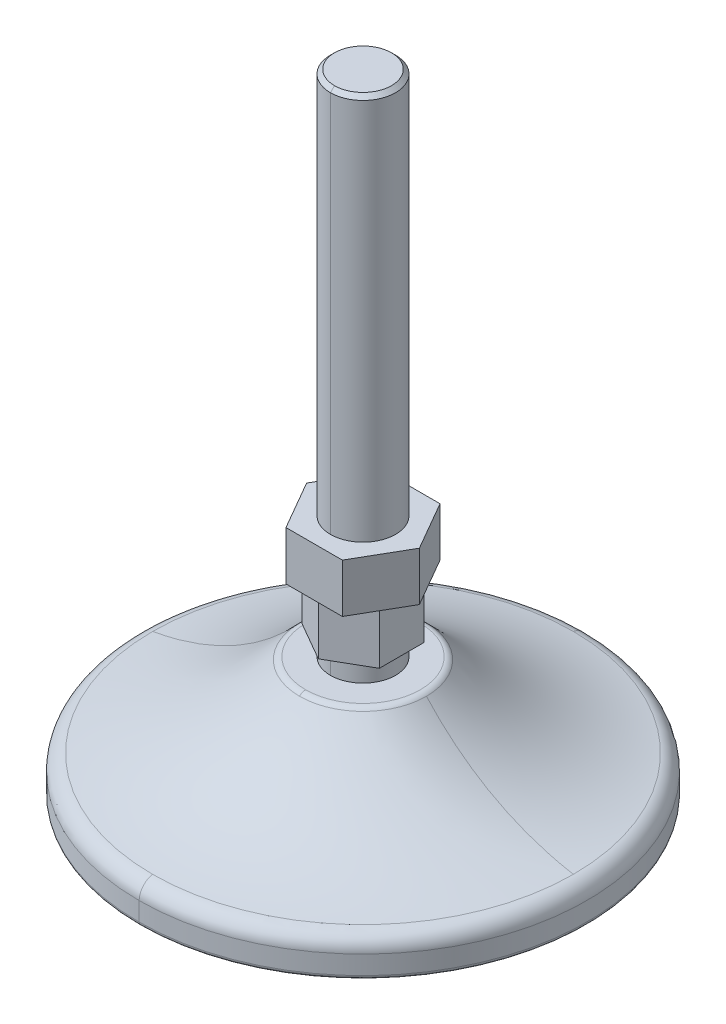
ISO-10303-21;
HEADER;
FILE_DESCRIPTION(('STEP AP214'),'2;1');
FILE_NAME('part.step','',(''),(''),'','','');
FILE_SCHEMA(('AUTOMOTIVE_DESIGN { 1 0 10303 214 1 1 1 1 }'));
ENDSEC;
DATA;
#1=APPLICATION_CONTEXT('core data for automotive mechanical design processes');
#2=APPLICATION_PROTOCOL_DEFINITION('international standard','automotive_design',2000,#1);
#3=PRODUCT_CONTEXT('',#1,'mechanical');
#4=PRODUCT('Part','Part','',(#3));
#5=PRODUCT_RELATED_PRODUCT_CATEGORY('part','',(#4));
#6=PRODUCT_DEFINITION_FORMATION('','',#4);
#7=PRODUCT_DEFINITION_CONTEXT('part definition',#1,'design');
#8=PRODUCT_DEFINITION('design','',#6,#7);
#9=PRODUCT_DEFINITION_SHAPE('','',#8);
#10=(LENGTH_UNIT() NAMED_UNIT(*) SI_UNIT(.MILLI.,.METRE.));
#11=(NAMED_UNIT(*) PLANE_ANGLE_UNIT() SI_UNIT($,.RADIAN.));
#12=(NAMED_UNIT(*) SI_UNIT($,.STERADIAN.) SOLID_ANGLE_UNIT());
#13=UNCERTAINTY_MEASURE_WITH_UNIT(LENGTH_MEASURE(1.E-05),#10,'distance_accuracy_value','');
#14=(GEOMETRIC_REPRESENTATION_CONTEXT(3) GLOBAL_UNCERTAINTY_ASSIGNED_CONTEXT((#13)) GLOBAL_UNIT_ASSIGNED_CONTEXT((#10,
#11,#12)) REPRESENTATION_CONTEXT('',''));
#15=CARTESIAN_POINT('',(0.,0.,0.));
#16=DIRECTION('',(0.,0.,1.));
#17=DIRECTION('',(1.,0.,0.));
#18=AXIS2_PLACEMENT_3D('',#15,#16,#17);
#19=CARTESIAN_POINT('',(0.,0.,0.));
#20=DIRECTION('',(0.,1.,0.));
#21=DIRECTION('',(0.,0.,1.));
#22=AXIS2_PLACEMENT_3D('',#19,#20,#21);
#23=CYLINDRICAL_SURFACE('',#22,8.);
#24=DIRECTION('',(0.,1.,0.));
#25=VECTOR('',#24,1.);
#26=CARTESIAN_POINT('',(0.,0.,-8.));
#27=LINE('',#26,#25);
#28=CARTESIAN_POINT('',(0.,-95.,-8.));
#29=VERTEX_POINT('',#28);
#30=CARTESIAN_POINT('',(0.,-1.,-8.));
#31=VERTEX_POINT('',#30);
#32=EDGE_CURVE('E297',#29,#31,#27,.T.);
#33=ORIENTED_EDGE('',*,*,#32,.F.);
#34=CARTESIAN_POINT('',(0.,-95.,0.));
#35=DIRECTION('',(0.,-1.,0.));
#36=DIRECTION('',(0.,0.,1.));
#37=AXIS2_PLACEMENT_3D('',#34,#35,#36);
#38=CIRCLE('',#37,8.);
#39=CARTESIAN_POINT('',(0.,-95.,8.));
#40=VERTEX_POINT('',#39);
#41=EDGE_CURVE('E408',#40,#29,#38,.T.);
#42=ORIENTED_EDGE('',*,*,#41,.F.);
#43=DIRECTION('',(0.,1.,0.));
#44=VECTOR('',#43,1.);
#45=CARTESIAN_POINT('',(0.,0.,8.));
#46=LINE('',#45,#44);
#47=CARTESIAN_POINT('',(0.,-1.,8.));
#48=VERTEX_POINT('',#47);
#49=EDGE_CURVE('E296',#40,#48,#46,.T.);
#50=ORIENTED_EDGE('',*,*,#49,.T.);
#51=CARTESIAN_POINT('',(0.,-1.,0.));
#52=DIRECTION('',(0.,1.,0.));
#53=DIRECTION('',(0.,0.,1.));
#54=AXIS2_PLACEMENT_3D('',#51,#52,#53);
#55=CIRCLE('',#54,8.);
#56=EDGE_CURVE('E10',#31,#48,#55,.T.);
#57=ORIENTED_EDGE('',*,*,#56,.F.);
#58=EDGE_LOOP('',(#33,#42,#50,#57));
#59=FACE_BOUND('',#58,.T.);
#60=ADVANCED_FACE('F16',(#59),#23,.T.);
#61=CARTESIAN_POINT('',(0.,0.,0.));
#62=DIRECTION('',(0.,-1.,0.));
#63=DIRECTION('',(0.,0.,-1.));
#64=AXIS2_PLACEMENT_3D('',#61,#62,#63);
#65=CONICAL_SURFACE('',#64,7.,0.785398163397448);
#66=DIRECTION('',(0.,-0.707106781186548,0.707106781186548));
#67=VECTOR('',#66,1.);
#68=CARTESIAN_POINT('',(0.,0.,7.));
#69=LINE('',#68,#67);
#70=CARTESIAN_POINT('',(0.,0.,7.));
#71=VERTEX_POINT('',#70);
#72=EDGE_CURVE('E402',#71,#48,#69,.T.);
#73=ORIENTED_EDGE('',*,*,#72,.F.);
#74=CARTESIAN_POINT('',(0.,0.,0.));
#75=DIRECTION('',(0.,1.,0.));
#76=DIRECTION('',(0.,0.,1.));
#77=AXIS2_PLACEMENT_3D('',#74,#75,#76);
#78=CIRCLE('',#77,7.);
#79=CARTESIAN_POINT('',(0.,0.,-7.));
#80=VERTEX_POINT('',#79);
#81=EDGE_CURVE('E27',#80,#71,#78,.T.);
#82=ORIENTED_EDGE('',*,*,#81,.F.);
#83=DIRECTION('',(0.,-0.707106781186548,-0.707106781186548));
#84=VECTOR('',#83,1.);
#85=CARTESIAN_POINT('',(0.,0.,-7.));
#86=LINE('',#85,#84);
#87=EDGE_CURVE('E362',#80,#31,#86,.T.);
#88=ORIENTED_EDGE('',*,*,#87,.T.);
#89=ORIENTED_EDGE('',*,*,#56,.T.);
#90=EDGE_LOOP('',(#73,#82,#88,#89));
#91=FACE_BOUND('',#90,.T.);
#92=ADVANCED_FACE('F533',(#91),#65,.T.);
#93=CARTESIAN_POINT('',(0.,0.,0.));
#94=DIRECTION('',(0.,1.,0.));
#95=DIRECTION('',(1.,0.,0.));
#96=AXIS2_PLACEMENT_3D('',#93,#94,#95);
#97=PLANE('',#96);
#98=ORIENTED_EDGE('',*,*,#81,.T.);
#99=CARTESIAN_POINT('',(0.,0.,0.));
#100=DIRECTION('',(0.,1.,0.));
#101=DIRECTION('',(0.,0.,1.));
#102=AXIS2_PLACEMENT_3D('',#99,#100,#101);
#103=CIRCLE('',#102,7.);
#104=EDGE_CURVE('E389',#71,#80,#103,.T.);
#105=ORIENTED_EDGE('',*,*,#104,.T.);
#106=EDGE_LOOP('',(#98,#105));
#107=FACE_BOUND('',#106,.T.);
#108=ADVANCED_FACE('F549',(#107),#97,.T.);
#109=CARTESIAN_POINT('',(0.,-95.,0.));
#110=DIRECTION('',(0.,1.,0.));
#111=DIRECTION('',(1.,0.,0.));
#112=AXIS2_PLACEMENT_3D('',#109,#110,#111);
#113=PLANE('',#112);
#114=ORIENTED_EDGE('',*,*,#41,.T.);
#115=CARTESIAN_POINT('',(0.,-95.,0.));
#116=DIRECTION('',(0.,-1.,0.));
#117=DIRECTION('',(0.,0.,1.));
#118=AXIS2_PLACEMENT_3D('',#115,#116,#117);
#119=CIRCLE('',#118,8.);
#120=EDGE_CURVE('E444',#29,#40,#119,.T.);
#121=ORIENTED_EDGE('',*,*,#120,.T.);
#122=EDGE_LOOP('',(#114,#121));
#123=FACE_BOUND('',#122,.T.);
#124=DIRECTION('',(0.5,0.,-0.866025403784439));
#125=VECTOR('',#124,1.);
#126=CARTESIAN_POINT('',(6.92820323027551,-95.,12.));
#127=LINE('',#126,#125);
#128=CARTESIAN_POINT('',(6.92820323027551,-95.,12.));
#129=VERTEX_POINT('',#128);
#130=CARTESIAN_POINT('',(13.856406460551,-95.,0.));
#131=VERTEX_POINT('',#130);
#132=EDGE_CURVE('E368',#129,#131,#127,.T.);
#133=ORIENTED_EDGE('',*,*,#132,.T.);
#134=DIRECTION('',(-0.5,0.,-0.866025403784438));
#135=VECTOR('',#134,1.);
#136=CARTESIAN_POINT('',(13.856406460551,-95.,0.));
#137=LINE('',#136,#135);
#138=CARTESIAN_POINT('',(6.92820323027551,-95.,-12.));
#139=VERTEX_POINT('',#138);
#140=EDGE_CURVE('E415',#131,#139,#137,.T.);
#141=ORIENTED_EDGE('',*,*,#140,.T.);
#142=DIRECTION('',(-1.,0.,0.));
#143=VECTOR('',#142,1.);
#144=CARTESIAN_POINT('',(6.92820323027551,-95.,-12.));
#145=LINE('',#144,#143);
#146=CARTESIAN_POINT('',(-6.92820323027551,-95.,-12.));
#147=VERTEX_POINT('',#146);
#148=EDGE_CURVE('E414',#139,#147,#145,.T.);
#149=ORIENTED_EDGE('',*,*,#148,.T.);
#150=DIRECTION('',(-0.5,0.,0.866025403784439));
#151=VECTOR('',#150,1.);
#152=CARTESIAN_POINT('',(-6.92820323027551,-95.,-12.));
#153=LINE('',#152,#151);
#154=CARTESIAN_POINT('',(-13.856406460551,-95.,0.));
#155=VERTEX_POINT('',#154);
#156=EDGE_CURVE('E247',#147,#155,#153,.T.);
#157=ORIENTED_EDGE('',*,*,#156,.T.);
#158=DIRECTION('',(0.5,0.,0.866025403784439));
#159=VECTOR('',#158,1.);
#160=CARTESIAN_POINT('',(-13.856406460551,-95.,0.));
#161=LINE('',#160,#159);
#162=CARTESIAN_POINT('',(-6.9282032302755,-95.,12.));
#163=VERTEX_POINT('',#162);
#164=EDGE_CURVE('E246',#155,#163,#161,.T.);
#165=ORIENTED_EDGE('',*,*,#164,.T.);
#166=DIRECTION('',(1.,0.,0.));
#167=VECTOR('',#166,1.);
#168=CARTESIAN_POINT('',(-6.9282032302755,-95.,12.));
#169=LINE('',#168,#167);
#170=EDGE_CURVE('E42',#163,#129,#169,.T.);
#171=ORIENTED_EDGE('',*,*,#170,.T.);
#172=EDGE_LOOP('',(#133,#141,#149,#157,#165,#171));
#173=FACE_BOUND('',#172,.T.);
#174=ADVANCED_FACE('F546',(#123,#173),#113,.T.);
#175=CARTESIAN_POINT('',(-6.9282032302755,-95.,12.));
#176=DIRECTION('',(0.,0.,-1.));
#177=DIRECTION('',(0.,-1.,0.));
#178=AXIS2_PLACEMENT_3D('',#175,#176,#177);
#179=PLANE('',#178);
#180=DIRECTION('',(1.,0.,0.));
#181=VECTOR('',#180,1.);
#182=CARTESIAN_POINT('',(-6.9282032302755,-107.,12.));
#183=LINE('',#182,#181);
#184=CARTESIAN_POINT('',(-6.9282032302755,-107.,12.));
#185=VERTEX_POINT('',#184);
#186=CARTESIAN_POINT('',(6.92820323027551,-107.,12.));
#187=VERTEX_POINT('',#186);
#188=EDGE_CURVE('E242',#185,#187,#183,.T.);
#189=ORIENTED_EDGE('',*,*,#188,.T.);
#190=DIRECTION('',(0.,-1.,0.));
#191=VECTOR('',#190,1.);
#192=CARTESIAN_POINT('',(6.92820323027551,-95.,12.));
#193=LINE('',#192,#191);
#194=EDGE_CURVE('E225',#129,#187,#193,.T.);
#195=ORIENTED_EDGE('',*,*,#194,.F.);
#196=ORIENTED_EDGE('',*,*,#170,.F.);
#197=DIRECTION('',(0.,-1.,0.));
#198=VECTOR('',#197,1.);
#199=CARTESIAN_POINT('',(-6.9282032302755,-95.,12.));
#200=LINE('',#199,#198);
#201=EDGE_CURVE('E238',#163,#185,#200,.T.);
#202=ORIENTED_EDGE('',*,*,#201,.T.);
#203=EDGE_LOOP('',(#189,#195,#196,#202));
#204=FACE_BOUND('',#203,.T.);
#205=ADVANCED_FACE('F240',(#204),#179,.F.);
#206=CARTESIAN_POINT('',(-13.856406460551,-95.,0.));
#207=DIRECTION('',(0.866025403784439,0.,-0.5));
#208=DIRECTION('',(0.,-1.,0.));
#209=AXIS2_PLACEMENT_3D('',#206,#207,#208);
#210=PLANE('',#209);
#211=DIRECTION('',(0.5,0.,0.866025403784439));
#212=VECTOR('',#211,1.);
#213=CARTESIAN_POINT('',(-13.856406460551,-107.,0.));
#214=LINE('',#213,#212);
#215=CARTESIAN_POINT('',(-13.856406460551,-107.,0.));
#216=VERTEX_POINT('',#215);
#217=EDGE_CURVE('E250',#216,#185,#214,.T.);
#218=ORIENTED_EDGE('',*,*,#217,.T.);
#219=ORIENTED_EDGE('',*,*,#201,.F.);
#220=ORIENTED_EDGE('',*,*,#164,.F.);
#221=DIRECTION('',(0.,-1.,0.));
#222=VECTOR('',#221,1.);
#223=CARTESIAN_POINT('',(-13.856406460551,-95.,0.));
#224=LINE('',#223,#222);
#225=EDGE_CURVE('E253',#155,#216,#224,.T.);
#226=ORIENTED_EDGE('',*,*,#225,.T.);
#227=EDGE_LOOP('',(#218,#219,#220,#226));
#228=FACE_BOUND('',#227,.T.);
#229=ADVANCED_FACE('F251',(#228),#210,.F.);
#230=CARTESIAN_POINT('',(-6.92820323027551,-95.,-12.));
#231=DIRECTION('',(0.866025403784439,0.,0.5));
#232=DIRECTION('',(0.,-1.,0.));
#233=AXIS2_PLACEMENT_3D('',#230,#231,#232);
#234=PLANE('',#233);
#235=DIRECTION('',(-0.5,0.,0.866025403784439));
#236=VECTOR('',#235,1.);
#237=CARTESIAN_POINT('',(-6.92820323027551,-107.,-12.));
#238=LINE('',#237,#236);
#239=CARTESIAN_POINT('',(-6.92820323027551,-107.,-12.));
#240=VERTEX_POINT('',#239);
#241=EDGE_CURVE('E257',#240,#216,#238,.T.);
#242=ORIENTED_EDGE('',*,*,#241,.T.);
#243=ORIENTED_EDGE('',*,*,#225,.F.);
#244=ORIENTED_EDGE('',*,*,#156,.F.);
#245=DIRECTION('',(0.,-1.,0.));
#246=VECTOR('',#245,1.);
#247=CARTESIAN_POINT('',(-6.92820323027551,-95.,-12.));
#248=LINE('',#247,#246);
#249=EDGE_CURVE('E116',#147,#240,#248,.T.);
#250=ORIENTED_EDGE('',*,*,#249,.T.);
#251=EDGE_LOOP('',(#242,#243,#244,#250));
#252=FACE_BOUND('',#251,.T.);
#253=ADVANCED_FACE('F594',(#252),#234,.F.);
#254=CARTESIAN_POINT('',(6.92820323027551,-95.,-12.));
#255=DIRECTION('',(0.,0.,1.));
#256=DIRECTION('',(1.,0.,0.));
#257=AXIS2_PLACEMENT_3D('',#254,#255,#256);
#258=PLANE('',#257);
#259=DIRECTION('',(-1.,0.,0.));
#260=VECTOR('',#259,1.);
#261=CARTESIAN_POINT('',(6.92820323027551,-107.,-12.));
#262=LINE('',#261,#260);
#263=CARTESIAN_POINT('',(6.92820323027551,-107.,-12.));
#264=VERTEX_POINT('',#263);
#265=EDGE_CURVE('E335',#264,#240,#262,.T.);
#266=ORIENTED_EDGE('',*,*,#265,.T.);
#267=ORIENTED_EDGE('',*,*,#249,.F.);
#268=ORIENTED_EDGE('',*,*,#148,.F.);
#269=DIRECTION('',(0.,-1.,0.));
#270=VECTOR('',#269,1.);
#271=CARTESIAN_POINT('',(6.92820323027551,-95.,-12.));
#272=LINE('',#271,#270);
#273=EDGE_CURVE('E103',#139,#264,#272,.T.);
#274=ORIENTED_EDGE('',*,*,#273,.T.);
#275=EDGE_LOOP('',(#266,#267,#268,#274));
#276=FACE_BOUND('',#275,.T.);
#277=ADVANCED_FACE('F562',(#276),#258,.F.);
#278=CARTESIAN_POINT('',(13.856406460551,-95.,0.));
#279=DIRECTION('',(-0.866025403784439,0.,0.5));
#280=DIRECTION('',(0.,1.,0.));
#281=AXIS2_PLACEMENT_3D('',#278,#279,#280);
#282=PLANE('',#281);
#283=DIRECTION('',(-0.5,0.,-0.866025403784438));
#284=VECTOR('',#283,1.);
#285=CARTESIAN_POINT('',(13.856406460551,-107.,0.));
#286=LINE('',#285,#284);
#287=CARTESIAN_POINT('',(13.856406460551,-107.,0.));
#288=VERTEX_POINT('',#287);
#289=EDGE_CURVE('E369',#288,#264,#286,.T.);
#290=ORIENTED_EDGE('',*,*,#289,.T.);
#291=ORIENTED_EDGE('',*,*,#273,.F.);
#292=ORIENTED_EDGE('',*,*,#140,.F.);
#293=DIRECTION('',(0.,-1.,0.));
#294=VECTOR('',#293,1.);
#295=CARTESIAN_POINT('',(13.856406460551,-95.,0.));
#296=LINE('',#295,#294);
#297=EDGE_CURVE('E232',#131,#288,#296,.T.);
#298=ORIENTED_EDGE('',*,*,#297,.T.);
#299=EDGE_LOOP('',(#290,#291,#292,#298));
#300=FACE_BOUND('',#299,.T.);
#301=ADVANCED_FACE('F552',(#300),#282,.F.);
#302=CARTESIAN_POINT('',(6.92820323027551,-95.,12.));
#303=DIRECTION('',(-0.866025403784439,0.,-0.5));
#304=DIRECTION('',(-0.5,0.,0.866025403784439));
#305=AXIS2_PLACEMENT_3D('',#302,#303,#304);
#306=PLANE('',#305);
#307=DIRECTION('',(0.5,0.,-0.866025403784439));
#308=VECTOR('',#307,1.);
#309=CARTESIAN_POINT('',(6.92820323027551,-107.,12.));
#310=LINE('',#309,#308);
#311=EDGE_CURVE('E259',#187,#288,#310,.T.);
#312=ORIENTED_EDGE('',*,*,#311,.T.);
#313=ORIENTED_EDGE('',*,*,#297,.F.);
#314=ORIENTED_EDGE('',*,*,#132,.F.);
#315=ORIENTED_EDGE('',*,*,#194,.T.);
#316=EDGE_LOOP('',(#312,#313,#314,#315));
#317=FACE_BOUND('',#316,.T.);
#318=ADVANCED_FACE('F18',(#317),#306,.F.);
#319=CARTESIAN_POINT('',(0.,-107.,0.));
#320=DIRECTION('',(0.,1.,0.));
#321=DIRECTION('',(1.,0.,0.));
#322=AXIS2_PLACEMENT_3D('',#319,#320,#321);
#323=PLANE('',#322);
#324=DIRECTION('',(0.,0.,-1.));
#325=VECTOR('',#324,1.);
#326=CARTESIAN_POINT('',(9.5,-107.,5.48482755730145));
#327=LINE('',#326,#325);
#328=CARTESIAN_POINT('',(9.5,-107.,5.48482755730145));
#329=VERTEX_POINT('',#328);
#330=CARTESIAN_POINT('',(9.5,-107.,-5.48482755730145));
#331=VERTEX_POINT('',#330);
#332=EDGE_CURVE('E266',#329,#331,#327,.T.);
#333=ORIENTED_EDGE('',*,*,#332,.T.);
#334=DIRECTION('',(-0.866025403784439,0.,-0.5));
#335=VECTOR('',#334,1.);
#336=CARTESIAN_POINT('',(9.5,-107.,-5.48482755730145));
#337=LINE('',#336,#335);
#338=CARTESIAN_POINT('',(0.,-107.,-10.9696551146029));
#339=VERTEX_POINT('',#338);
#340=EDGE_CURVE('E286',#331,#339,#337,.T.);
#341=ORIENTED_EDGE('',*,*,#340,.T.);
#342=DIRECTION('',(-0.866025403784439,0.,0.5));
#343=VECTOR('',#342,1.);
#344=CARTESIAN_POINT('',(0.,-107.,-10.9696551146029));
#345=LINE('',#344,#343);
#346=CARTESIAN_POINT('',(-9.5,-107.,-5.48482755730145));
#347=VERTEX_POINT('',#346);
#348=EDGE_CURVE('E281',#339,#347,#345,.T.);
#349=ORIENTED_EDGE('',*,*,#348,.T.);
#350=DIRECTION('',(0.,0.,1.));
#351=VECTOR('',#350,1.);
#352=CARTESIAN_POINT('',(-9.5,-107.,-5.48482755730145));
#353=LINE('',#352,#351);
#354=CARTESIAN_POINT('',(-9.5,-107.,5.48482755730144));
#355=VERTEX_POINT('',#354);
#356=EDGE_CURVE('E303',#347,#355,#353,.T.);
#357=ORIENTED_EDGE('',*,*,#356,.T.);
#358=DIRECTION('',(0.866025403784439,0.,0.5));
#359=VECTOR('',#358,1.);
#360=CARTESIAN_POINT('',(-9.5,-107.,5.48482755730144));
#361=LINE('',#360,#359);
#362=CARTESIAN_POINT('',(0.,-107.,10.9696551146029));
#363=VERTEX_POINT('',#362);
#364=EDGE_CURVE('E318',#355,#363,#361,.T.);
#365=ORIENTED_EDGE('',*,*,#364,.T.);
#366=DIRECTION('',(0.866025403784439,0.,-0.5));
#367=VECTOR('',#366,1.);
#368=CARTESIAN_POINT('',(0.,-107.,10.9696551146029));
#369=LINE('',#368,#367);
#370=EDGE_CURVE('E275',#363,#329,#369,.T.);
#371=ORIENTED_EDGE('',*,*,#370,.T.);
#372=EDGE_LOOP('',(#333,#341,#349,#357,#365,#371));
#373=FACE_BOUND('',#372,.T.);
#374=ORIENTED_EDGE('',*,*,#311,.F.);
#375=ORIENTED_EDGE('',*,*,#188,.F.);
#376=ORIENTED_EDGE('',*,*,#217,.F.);
#377=ORIENTED_EDGE('',*,*,#241,.F.);
#378=ORIENTED_EDGE('',*,*,#265,.F.);
#379=ORIENTED_EDGE('',*,*,#289,.F.);
#380=EDGE_LOOP('',(#374,#375,#376,#377,#378,#379));
#381=FACE_BOUND('',#380,.T.);
#382=ADVANCED_FACE('F258',(#373,#381),#323,.F.);
#383=CARTESIAN_POINT('',(0.,-120.,0.));
#384=DIRECTION('',(0.,1.,0.));
#385=DIRECTION('',(1.,0.,0.));
#386=AXIS2_PLACEMENT_3D('',#383,#384,#385);
#387=PLANE('',#386);
#388=CARTESIAN_POINT('',(0.,-120.,0.));
#389=DIRECTION('',(0.,-1.,0.));
#390=DIRECTION('',(0.,0.,1.));
#391=AXIS2_PLACEMENT_3D('',#388,#389,#390);
#392=CIRCLE('',#391,8.);
#393=CARTESIAN_POINT('',(0.,-120.,8.));
#394=VERTEX_POINT('',#393);
#395=CARTESIAN_POINT('',(0.,-120.,-8.));
#396=VERTEX_POINT('',#395);
#397=EDGE_CURVE('E304',#394,#396,#392,.T.);
#398=ORIENTED_EDGE('',*,*,#397,.F.);
#399=CARTESIAN_POINT('',(0.,-120.,0.));
#400=DIRECTION('',(0.,-1.,0.));
#401=DIRECTION('',(0.,0.,1.));
#402=AXIS2_PLACEMENT_3D('',#399,#400,#401);
#403=CIRCLE('',#402,8.);
#404=EDGE_CURVE('E398',#396,#394,#403,.T.);
#405=ORIENTED_EDGE('',*,*,#404,.F.);
#406=EDGE_LOOP('',(#398,#405));
#407=FACE_BOUND('',#406,.T.);
#408=DIRECTION('',(-0.866025403784439,0.,-0.5));
#409=VECTOR('',#408,1.);
#410=CARTESIAN_POINT('',(9.5,-120.,-5.48482755730145));
#411=LINE('',#410,#409);
#412=CARTESIAN_POINT('',(9.5,-120.,-5.48482755730145));
#413=VERTEX_POINT('',#412);
#414=CARTESIAN_POINT('',(0.,-120.,-10.9696551146029));
#415=VERTEX_POINT('',#414);
#416=EDGE_CURVE('E287',#413,#415,#411,.T.);
#417=ORIENTED_EDGE('',*,*,#416,.F.);
#418=DIRECTION('',(0.,0.,-1.));
#419=VECTOR('',#418,1.);
#420=CARTESIAN_POINT('',(9.5,-120.,5.48482755730145));
#421=LINE('',#420,#419);
#422=CARTESIAN_POINT('',(9.5,-120.,5.48482755730145));
#423=VERTEX_POINT('',#422);
#424=EDGE_CURVE('E272',#423,#413,#421,.T.);
#425=ORIENTED_EDGE('',*,*,#424,.F.);
#426=DIRECTION('',(0.866025403784439,0.,-0.5));
#427=VECTOR('',#426,1.);
#428=CARTESIAN_POINT('',(0.,-120.,10.9696551146029));
#429=LINE('',#428,#427);
#430=CARTESIAN_POINT('',(0.,-120.,10.9696551146029));
#431=VERTEX_POINT('',#430);
#432=EDGE_CURVE('E322',#431,#423,#429,.T.);
#433=ORIENTED_EDGE('',*,*,#432,.F.);
#434=DIRECTION('',(0.866025403784439,0.,0.5));
#435=VECTOR('',#434,1.);
#436=CARTESIAN_POINT('',(-9.5,-120.,5.48482755730144));
#437=LINE('',#436,#435);
#438=CARTESIAN_POINT('',(-9.5,-120.,5.48482755730144));
#439=VERTEX_POINT('',#438);
#440=EDGE_CURVE('E298',#439,#431,#437,.T.);
#441=ORIENTED_EDGE('',*,*,#440,.F.);
#442=DIRECTION('',(0.,0.,1.));
#443=VECTOR('',#442,1.);
#444=CARTESIAN_POINT('',(-9.5,-120.,-5.48482755730145));
#445=LINE('',#444,#443);
#446=CARTESIAN_POINT('',(-9.5,-120.,-5.48482755730145));
#447=VERTEX_POINT('',#446);
#448=EDGE_CURVE('E276',#447,#439,#445,.T.);
#449=ORIENTED_EDGE('',*,*,#448,.F.);
#450=DIRECTION('',(-0.866025403784439,0.,0.5));
#451=VECTOR('',#450,1.);
#452=CARTESIAN_POINT('',(0.,-120.,-10.9696551146029));
#453=LINE('',#452,#451);
#454=EDGE_CURVE('E327',#415,#447,#453,.T.);
#455=ORIENTED_EDGE('',*,*,#454,.F.);
#456=EDGE_LOOP('',(#417,#425,#433,#441,#449,#455));
#457=FACE_BOUND('',#456,.T.);
#458=ADVANCED_FACE('F559',(#407,#457),#387,.F.);
#459=CARTESIAN_POINT('',(9.5,-107.,5.48482755730145));
#460=DIRECTION('',(-1.,0.,0.));
#461=DIRECTION('',(0.,0.,1.));
#462=AXIS2_PLACEMENT_3D('',#459,#460,#461);
#463=PLANE('',#462);
#464=ORIENTED_EDGE('',*,*,#424,.T.);
#465=DIRECTION('',(0.,-1.,0.));
#466=VECTOR('',#465,1.);
#467=CARTESIAN_POINT('',(9.5,-107.,-5.48482755730145));
#468=LINE('',#467,#466);
#469=EDGE_CURVE('E373',#331,#413,#468,.T.);
#470=ORIENTED_EDGE('',*,*,#469,.F.);
#471=ORIENTED_EDGE('',*,*,#332,.F.);
#472=DIRECTION('',(0.,-1.,0.));
#473=VECTOR('',#472,1.);
#474=CARTESIAN_POINT('',(9.5,-107.,5.48482755730145));
#475=LINE('',#474,#473);
#476=EDGE_CURVE('E394',#329,#423,#475,.T.);
#477=ORIENTED_EDGE('',*,*,#476,.T.);
#478=EDGE_LOOP('',(#464,#470,#471,#477));
#479=FACE_BOUND('',#478,.T.);
#480=ADVANCED_FACE('F660',(#479),#463,.F.);
#481=CARTESIAN_POINT('',(0.,-107.,10.9696551146029));
#482=DIRECTION('',(-0.5,0.,-0.866025403784439));
#483=DIRECTION('',(-0.866025403784439,0.,0.5));
#484=AXIS2_PLACEMENT_3D('',#481,#482,#483);
#485=PLANE('',#484);
#486=ORIENTED_EDGE('',*,*,#432,.T.);
#487=ORIENTED_EDGE('',*,*,#476,.F.);
#488=ORIENTED_EDGE('',*,*,#370,.F.);
#489=DIRECTION('',(0.,-1.,0.));
#490=VECTOR('',#489,1.);
#491=CARTESIAN_POINT('',(0.,-107.,10.9696551146029));
#492=LINE('',#491,#490);
#493=EDGE_CURVE('E302',#363,#431,#492,.T.);
#494=ORIENTED_EDGE('',*,*,#493,.T.);
#495=EDGE_LOOP('',(#486,#487,#488,#494));
#496=FACE_BOUND('',#495,.T.);
#497=ADVANCED_FACE('F657',(#496),#485,.F.);
#498=CARTESIAN_POINT('',(-9.5,-107.,5.48482755730144));
#499=DIRECTION('',(0.5,0.,-0.866025403784439));
#500=DIRECTION('',(0.,-1.,0.));
#501=AXIS2_PLACEMENT_3D('',#498,#499,#500);
#502=PLANE('',#501);
#503=ORIENTED_EDGE('',*,*,#440,.T.);
#504=ORIENTED_EDGE('',*,*,#493,.F.);
#505=ORIENTED_EDGE('',*,*,#364,.F.);
#506=DIRECTION('',(0.,-1.,0.));
#507=VECTOR('',#506,1.);
#508=CARTESIAN_POINT('',(-9.5,-107.,5.48482755730144));
#509=LINE('',#508,#507);
#510=EDGE_CURVE('E280',#355,#439,#509,.T.);
#511=ORIENTED_EDGE('',*,*,#510,.T.);
#512=EDGE_LOOP('',(#503,#504,#505,#511));
#513=FACE_BOUND('',#512,.T.);
#514=ADVANCED_FACE('F578',(#513),#502,.F.);
#515=CARTESIAN_POINT('',(-9.5,-107.,-5.48482755730145));
#516=DIRECTION('',(1.,0.,0.));
#517=DIRECTION('',(0.,1.,0.));
#518=AXIS2_PLACEMENT_3D('',#515,#516,#517);
#519=PLANE('',#518);
#520=ORIENTED_EDGE('',*,*,#448,.T.);
#521=ORIENTED_EDGE('',*,*,#510,.F.);
#522=ORIENTED_EDGE('',*,*,#356,.F.);
#523=DIRECTION('',(0.,-1.,0.));
#524=VECTOR('',#523,1.);
#525=CARTESIAN_POINT('',(-9.5,-107.,-5.48482755730145));
#526=LINE('',#525,#524);
#527=EDGE_CURVE('E323',#347,#447,#526,.T.);
#528=ORIENTED_EDGE('',*,*,#527,.T.);
#529=EDGE_LOOP('',(#520,#521,#522,#528));
#530=FACE_BOUND('',#529,.T.);
#531=ADVANCED_FACE('F574',(#530),#519,.F.);
#532=CARTESIAN_POINT('',(0.,-107.,-10.9696551146029));
#533=DIRECTION('',(0.5,0.,0.866025403784439));
#534=DIRECTION('',(0.,-1.,0.));
#535=AXIS2_PLACEMENT_3D('',#532,#533,#534);
#536=PLANE('',#535);
#537=ORIENTED_EDGE('',*,*,#454,.T.);
#538=ORIENTED_EDGE('',*,*,#527,.F.);
#539=ORIENTED_EDGE('',*,*,#348,.F.);
#540=DIRECTION('',(0.,-1.,0.));
#541=VECTOR('',#540,1.);
#542=CARTESIAN_POINT('',(0.,-107.,-10.9696551146029));
#543=LINE('',#542,#541);
#544=EDGE_CURVE('E282',#339,#415,#543,.T.);
#545=ORIENTED_EDGE('',*,*,#544,.T.);
#546=EDGE_LOOP('',(#537,#538,#539,#545));
#547=FACE_BOUND('',#546,.T.);
#548=ADVANCED_FACE('F577',(#547),#536,.F.);
#549=CARTESIAN_POINT('',(9.5,-107.,-5.48482755730145));
#550=DIRECTION('',(-0.5,0.,0.866025403784439));
#551=DIRECTION('',(0.,1.,0.));
#552=AXIS2_PLACEMENT_3D('',#549,#550,#551);
#553=PLANE('',#552);
#554=ORIENTED_EDGE('',*,*,#416,.T.);
#555=ORIENTED_EDGE('',*,*,#544,.F.);
#556=ORIENTED_EDGE('',*,*,#340,.F.);
#557=ORIENTED_EDGE('',*,*,#469,.T.);
#558=EDGE_LOOP('',(#554,#555,#556,#557));
#559=FACE_BOUND('',#558,.T.);
#560=ADVANCED_FACE('F625',(#559),#553,.F.);
#561=CARTESIAN_POINT('',(-54.,-155.,0.));
#562=DIRECTION('',(0.,-1.,0.));
#563=DIRECTION('',(0.,0.,-1.));
#564=AXIS2_PLACEMENT_3D('',#561,#562,#563);
#565=PLANE('',#564);
#566=CARTESIAN_POINT('',(0.,-155.,0.));
#567=DIRECTION('',(0.,1.,0.));
#568=DIRECTION('',(0.,0.,1.));
#569=AXIS2_PLACEMENT_3D('',#566,#567,#568);
#570=CIRCLE('',#569,54.);
#571=CARTESIAN_POINT('',(0.,-155.,54.));
#572=VERTEX_POINT('',#571);
#573=CARTESIAN_POINT('',(0.,-155.,-54.));
#574=VERTEX_POINT('',#573);
#575=EDGE_CURVE('E357',#572,#574,#570,.T.);
#576=ORIENTED_EDGE('',*,*,#575,.F.);
#577=CARTESIAN_POINT('',(0.,-155.,0.));
#578=DIRECTION('',(0.,1.,0.));
#579=DIRECTION('',(0.,0.,1.));
#580=AXIS2_PLACEMENT_3D('',#577,#578,#579);
#581=CIRCLE('',#580,54.);
#582=EDGE_CURVE('E291',#574,#572,#581,.T.);
#583=ORIENTED_EDGE('',*,*,#582,.F.);
#584=EDGE_LOOP('',(#576,#583));
#585=FACE_BOUND('',#584,.T.);
#586=ADVANCED_FACE('F621',(#585),#565,.T.);
#587=CARTESIAN_POINT('',(0.,-154.,0.));
#588=DIRECTION('',(0.,1.,0.));
#589=DIRECTION('',(0.,0.,1.));
#590=AXIS2_PLACEMENT_3D('',#587,#588,#589);
#591=TOROIDAL_SURFACE('',#590,54.,1.);
#592=CARTESIAN_POINT('',(0.,-154.,-54.));
#593=DIRECTION('',(1.,0.,0.));
#594=DIRECTION('',(0.,0.,-1.));
#595=AXIS2_PLACEMENT_3D('',#592,#593,#594);
#596=CIRCLE('',#595,1.);
#597=CARTESIAN_POINT('',(0.,-154.,-55.));
#598=VERTEX_POINT('',#597);
#599=EDGE_CURVE('E361',#574,#598,#596,.T.);
#600=ORIENTED_EDGE('',*,*,#599,.F.);
#601=ORIENTED_EDGE('',*,*,#582,.T.);
#602=CARTESIAN_POINT('',(0.,-154.,54.));
#603=DIRECTION('',(-1.,0.,0.));
#604=DIRECTION('',(0.,0.,1.));
#605=AXIS2_PLACEMENT_3D('',#602,#603,#604);
#606=CIRCLE('',#605,1.);
#607=CARTESIAN_POINT('',(0.,-154.,55.));
#608=VERTEX_POINT('',#607);
#609=EDGE_CURVE('E341',#572,#608,#606,.T.);
#610=ORIENTED_EDGE('',*,*,#609,.T.);
#611=CARTESIAN_POINT('',(0.,-154.,0.));
#612=DIRECTION('',(0.,1.,0.));
#613=DIRECTION('',(0.,0.,1.));
#614=AXIS2_PLACEMENT_3D('',#611,#612,#613);
#615=CIRCLE('',#614,55.);
#616=EDGE_CURVE('E317',#598,#608,#615,.T.);
#617=ORIENTED_EDGE('',*,*,#616,.F.);
#618=EDGE_LOOP('',(#600,#601,#610,#617));
#619=FACE_BOUND('',#618,.T.);
#620=ADVANCED_FACE('F624',(#619),#591,.T.);
#621=CARTESIAN_POINT('',(0.,0.,0.));
#622=DIRECTION('',(0.,1.,0.));
#623=DIRECTION('',(0.,0.,1.));
#624=AXIS2_PLACEMENT_3D('',#621,#622,#623);
#625=CYLINDRICAL_SURFACE('',#624,55.);
#626=DIRECTION('',(0.,1.,0.));
#627=VECTOR('',#626,1.);
#628=CARTESIAN_POINT('',(0.,0.,-55.));
#629=LINE('',#628,#627);
#630=CARTESIAN_POINT('',(0.,-149.432030665135,-55.));
#631=VERTEX_POINT('',#630);
#632=EDGE_CURVE('E336',#598,#631,#629,.T.);
#633=ORIENTED_EDGE('',*,*,#632,.F.);
#634=ORIENTED_EDGE('',*,*,#616,.T.);
#635=DIRECTION('',(0.,1.,0.));
#636=VECTOR('',#635,1.);
#637=CARTESIAN_POINT('',(0.,0.,55.));
#638=LINE('',#637,#636);
#639=CARTESIAN_POINT('',(0.,-149.432030665135,55.));
#640=VERTEX_POINT('',#639);
#641=EDGE_CURVE('E489',#608,#640,#638,.T.);
#642=ORIENTED_EDGE('',*,*,#641,.T.);
#643=CARTESIAN_POINT('',(0.,-149.432030665135,0.));
#644=DIRECTION('',(0.,1.,0.));
#645=DIRECTION('',(0.,0.,1.));
#646=AXIS2_PLACEMENT_3D('',#643,#644,#645);
#647=CIRCLE('',#646,55.);
#648=EDGE_CURVE('E270',#631,#640,#647,.T.);
#649=ORIENTED_EDGE('',*,*,#648,.F.);
#650=EDGE_LOOP('',(#633,#634,#642,#649));
#651=FACE_BOUND('',#650,.T.);
#652=ADVANCED_FACE('F616',(#651),#625,.T.);
#653=CARTESIAN_POINT('',(0.,-149.432030665135,0.));
#654=DIRECTION('',(0.,1.,0.));
#655=DIRECTION('',(0.,0.,1.));
#656=AXIS2_PLACEMENT_3D('',#653,#654,#655);
#657=TOROIDAL_SURFACE('',#656,51.,4.);
#658=CARTESIAN_POINT('',(0.,-149.432030665135,-51.));
#659=DIRECTION('',(1.,0.,0.));
#660=DIRECTION('',(0.,0.,-1.));
#661=AXIS2_PLACEMENT_3D('',#658,#659,#660);
#662=CIRCLE('',#661,4.);
#663=CARTESIAN_POINT('',(0.,-145.493250014533,-51.6971420131087));
#664=VERTEX_POINT('',#663);
#665=EDGE_CURVE('E169',#631,#664,#662,.T.);
#666=ORIENTED_EDGE('',*,*,#665,.F.);
#667=ORIENTED_EDGE('',*,*,#648,.T.);
#668=CARTESIAN_POINT('',(0.,-149.432030665135,51.));
#669=DIRECTION('',(-1.,0.,0.));
#670=DIRECTION('',(0.,0.,1.));
#671=AXIS2_PLACEMENT_3D('',#668,#669,#670);
#672=CIRCLE('',#671,4.);
#673=CARTESIAN_POINT('',(0.,-145.493250014533,51.6971420131087));
#674=VERTEX_POINT('',#673);
#675=EDGE_CURVE('E313',#640,#674,#672,.T.);
#676=ORIENTED_EDGE('',*,*,#675,.T.);
#677=CARTESIAN_POINT('',(0.,-145.493250014533,0.));
#678=DIRECTION('',(0.,1.,0.));
#679=DIRECTION('',(0.,0.,1.));
#680=AXIS2_PLACEMENT_3D('',#677,#678,#679);
#681=CIRCLE('',#680,51.6971420131087);
#682=CARTESIAN_POINT('',(-51.6971420131087,-145.493250014533,0.));
#683=VERTEX_POINT('',#682);
#684=EDGE_CURVE('E181',#683,#674,#681,.T.);
#685=ORIENTED_EDGE('',*,*,#684,.F.);
#686=CARTESIAN_POINT('',(0.,-145.493250014533,0.));
#687=DIRECTION('',(0.,1.,0.));
#688=DIRECTION('',(0.,0.,1.));
#689=AXIS2_PLACEMENT_3D('',#686,#687,#688);
#690=CIRCLE('',#689,51.6971420131087);
#691=EDGE_CURVE('E342',#664,#683,#690,.T.);
#692=ORIENTED_EDGE('',*,*,#691,.F.);
#693=EDGE_LOOP('',(#666,#667,#676,#685,#692));
#694=FACE_BOUND('',#693,.T.);
#695=ADVANCED_FACE('F612',(#694),#657,.T.);
#696=CARTESIAN_POINT('',(-15.5875552081551,-125.654040357076,0.));
#697=CARTESIAN_POINT('',(-15.5875552081551,-125.654040357076,31.1751104163101));
#698=CARTESIAN_POINT('',(15.5875552081551,-125.654040357076,31.1751104163101));
#699=CARTESIAN_POINT('',(15.5875552081551,-125.654040357076,0.));
#700=CARTESIAN_POINT('',(-20.0555297023163,-130.564716230437,0.));
#701=CARTESIAN_POINT('',(-20.0555297023163,-130.564716230437,40.1110594046326));
#702=CARTESIAN_POINT('',(20.0555297023163,-130.564716230437,40.1110594046326));
#703=CARTESIAN_POINT('',(20.0555297023163,-130.564716230437,0.));
#704=CARTESIAN_POINT('',(-30.8847117425062,-139.382189017099,0.));
#705=CARTESIAN_POINT('',(-30.8847117425062,-139.382189017099,61.7694234850125));
#706=CARTESIAN_POINT('',(30.8847117425062,-139.382189017099,61.7694234850125));
#707=CARTESIAN_POINT('',(30.8847117425062,-139.382189017099,0.));
#708=CARTESIAN_POINT('',(-43.9978524027035,-144.130519074519,0.));
#709=CARTESIAN_POINT('',(-43.9978524027034,-144.130519074519,87.9957048054069));
#710=CARTESIAN_POINT('',(43.9978524027034,-144.130519074519,87.9957048054069));
#711=CARTESIAN_POINT('',(43.9978524027035,-144.130519074519,0.));
#712=CARTESIAN_POINT('',(-51.6971420131087,-145.493250014533,0.));
#713=CARTESIAN_POINT('',(-51.6971420131086,-145.493250014533,103.394284026217));
#714=CARTESIAN_POINT('',(51.6971420131086,-145.493250014533,103.394284026217));
#715=CARTESIAN_POINT('',(51.6971420131087,-145.493250014533,0.));
#716=(BOUNDED_SURFACE() B_SPLINE_SURFACE(3,3,((#696,#697,#698,#699),(#700,#701,#702,#703),(#704,
#705,#706,#707),(#708,#709,#710,#711),(#712,#713,#714,#715)),.UNSPECIFIED.,.F.,.F.,
.F.) B_SPLINE_SURFACE_WITH_KNOTS((4,1,4),(4,4),(0.0185462282992376,0.43946403027003,
0.930605430488948),(0.,1.),
.UNSPECIFIED.) GEOMETRIC_REPRESENTATION_ITEM() RATIONAL_B_SPLINE_SURFACE(((1.,0.333333333333334,
0.333333333333334,1.),(1.,0.333333333333334,0.333333333333334,1.),(1.,0.333333333333334,
0.333333333333334,1.),(1.,0.333333333333334,0.333333333333334,1.),(1.,0.333333333333334,
0.333333333333334,1.))) REPRESENTATION_ITEM('') SURFACE());
#717=CARTESIAN_POINT('',(15.5875552081551,-125.654040357076,0.));
#718=CARTESIAN_POINT('',(20.0555297023163,-130.564716230437,0.));
#719=CARTESIAN_POINT('',(30.8847117425062,-139.382189017099,0.));
#720=CARTESIAN_POINT('',(43.9978524027035,-144.130519074519,0.));
#721=CARTESIAN_POINT('',(51.6971420131087,-145.493250014533,0.));
#722=(BOUNDED_CURVE() B_SPLINE_CURVE(3,(#717,#718,#719,#720,#721),.UNSPECIFIED.,.F.,
.F.) B_SPLINE_CURVE_WITH_KNOTS((4,1,4),(0.0185462282992376,0.43946403027003,0.930605430488948),
.UNSPECIFIED.) CURVE() GEOMETRIC_REPRESENTATION_ITEM() RATIONAL_B_SPLINE_CURVE((1.,1.,1.,1.,1.)) REPRESENTATION_ITEM(''));
#723=CARTESIAN_POINT('',(15.5875552081551,-125.654040357076,0.));
#724=VERTEX_POINT('',#723);
#725=CARTESIAN_POINT('',(51.6971420131087,-145.493250014533,0.));
#726=VERTEX_POINT('',#725);
#727=EDGE_CURVE('E466',#724,#726,#722,.T.);
#728=CARTESIAN_POINT('',(0.,-125.654040357076,0.));
#729=DIRECTION('',(0.,1.,0.));
#730=DIRECTION('',(0.,0.,1.));
#731=AXIS2_PLACEMENT_3D('',#728,#729,#730);
#732=CIRCLE('',#731,15.5875552081551);
#733=CARTESIAN_POINT('',(0.,-125.654040357076,15.5875552081551));
#734=VERTEX_POINT('',#733);
#735=EDGE_CURVE('E348',#734,#724,#732,.T.);
#736=CARTESIAN_POINT('',(0.,-125.654040357076,0.));
#737=DIRECTION('',(0.,1.,0.));
#738=DIRECTION('',(0.,0.,1.));
#739=AXIS2_PLACEMENT_3D('',#736,#737,#738);
#740=CIRCLE('',#739,15.5875552081551);
#741=CARTESIAN_POINT('',(-15.5875552081551,-125.654040357076,0.));
#742=VERTEX_POINT('',#741);
#743=EDGE_CURVE('E271',#742,#734,#740,.T.);
#744=CARTESIAN_POINT('',(-15.5875552081551,-125.654040357076,0.));
#745=CARTESIAN_POINT('',(-20.0555297023163,-130.564716230437,0.));
#746=CARTESIAN_POINT('',(-30.8847117425062,-139.382189017099,0.));
#747=CARTESIAN_POINT('',(-43.9978524027035,-144.130519074519,0.));
#748=CARTESIAN_POINT('',(-51.6971420131087,-145.493250014533,0.));
#749=(BOUNDED_CURVE() B_SPLINE_CURVE(3,(#744,#745,#746,#747,#748),.UNSPECIFIED.,.F.,
.F.) B_SPLINE_CURVE_WITH_KNOTS((4,1,4),(0.0185462282992376,0.43946403027003,0.930605430488948),
.UNSPECIFIED.) CURVE() GEOMETRIC_REPRESENTATION_ITEM() RATIONAL_B_SPLINE_CURVE((1.,1.,1.,1.,1.)) REPRESENTATION_ITEM(''));
#750=EDGE_CURVE('E346',#742,#683,#749,.T.);
#751=CARTESIAN_POINT('',(0.,-145.493250014533,0.));
#752=DIRECTION('',(0.,1.,0.));
#753=DIRECTION('',(0.,0.,1.));
#754=AXIS2_PLACEMENT_3D('',#751,#752,#753);
#755=CIRCLE('',#754,51.6971420131087);
#756=EDGE_CURVE('E310',#674,#726,#755,.T.);
#757=ORIENTED_EDGE('',*,*,#727,.F.);
#758=ORIENTED_EDGE('',*,*,#735,.F.);
#759=ORIENTED_EDGE('',*,*,#743,.F.);
#760=ORIENTED_EDGE('',*,*,#750,.T.);
#761=ORIENTED_EDGE('',*,*,#684,.T.);
#762=ORIENTED_EDGE('',*,*,#756,.T.);
#763=EDGE_LOOP('',(#757,#758,#759,#760,#761,#762));
#764=FACE_BOUND('',#763,.T.);
#765=ADVANCED_FACE('F615',(#764),#716,.T.);
#766=CARTESIAN_POINT('',(0.,-127.,0.));
#767=DIRECTION('',(0.,1.,0.));
#768=DIRECTION('',(0.,0.,1.));
#769=AXIS2_PLACEMENT_3D('',#766,#767,#768);
#770=TOROIDAL_SURFACE('',#769,14.1082335258896,2.);
#771=CARTESIAN_POINT('',(0.,-127.,-14.1082335258896));
#772=DIRECTION('',(1.,0.,0.));
#773=DIRECTION('',(0.,0.,-1.));
#774=AXIS2_PLACEMENT_3D('',#771,#772,#773);
#775=CIRCLE('',#774,2.);
#776=CARTESIAN_POINT('',(0.,-125.654040357076,-15.5875552081551));
#777=VERTEX_POINT('',#776);
#778=CARTESIAN_POINT('',(0.,-125.,-14.1082335258896));
#779=VERTEX_POINT('',#778);
#780=EDGE_CURVE('E351',#777,#779,#775,.T.);
#781=ORIENTED_EDGE('',*,*,#780,.F.);
#782=CARTESIAN_POINT('',(0.,-125.654040357076,0.));
#783=DIRECTION('',(0.,1.,0.));
#784=DIRECTION('',(0.,0.,1.));
#785=AXIS2_PLACEMENT_3D('',#782,#783,#784);
#786=CIRCLE('',#785,15.5875552081551);
#787=EDGE_CURVE('E383',#777,#742,#786,.T.);
#788=ORIENTED_EDGE('',*,*,#787,.T.);
#789=ORIENTED_EDGE('',*,*,#743,.T.);
#790=CARTESIAN_POINT('',(0.,-127.,14.1082335258896));
#791=DIRECTION('',(-1.,0.,0.));
#792=DIRECTION('',(0.,0.,1.));
#793=AXIS2_PLACEMENT_3D('',#790,#791,#792);
#794=CIRCLE('',#793,2.);
#795=CARTESIAN_POINT('',(0.,-125.,14.1082335258896));
#796=VERTEX_POINT('',#795);
#797=EDGE_CURVE('E374',#734,#796,#794,.T.);
#798=ORIENTED_EDGE('',*,*,#797,.T.);
#799=CARTESIAN_POINT('',(0.,-125.,0.));
#800=DIRECTION('',(0.,1.,0.));
#801=DIRECTION('',(0.,0.,1.));
#802=AXIS2_PLACEMENT_3D('',#799,#800,#801);
#803=CIRCLE('',#802,14.1082335258896);
#804=EDGE_CURVE('E308',#779,#796,#803,.T.);
#805=ORIENTED_EDGE('',*,*,#804,.F.);
#806=EDGE_LOOP('',(#781,#788,#789,#798,#805));
#807=FACE_BOUND('',#806,.T.);
#808=ADVANCED_FACE('F584',(#807),#770,.T.);
#809=CARTESIAN_POINT('',(-8.,-125.,0.));
#810=DIRECTION('',(0.,1.,0.));
#811=DIRECTION('',(1.,0.,0.));
#812=AXIS2_PLACEMENT_3D('',#809,#810,#811);
#813=PLANE('',#812);
#814=CARTESIAN_POINT('',(0.,-125.,0.));
#815=DIRECTION('',(0.,1.,0.));
#816=DIRECTION('',(0.,0.,1.));
#817=AXIS2_PLACEMENT_3D('',#814,#815,#816);
#818=CIRCLE('',#817,8.);
#819=CARTESIAN_POINT('',(0.,-125.,8.));
#820=VERTEX_POINT('',#819);
#821=CARTESIAN_POINT('',(0.,-125.,-8.));
#822=VERTEX_POINT('',#821);
#823=EDGE_CURVE('E378',#820,#822,#818,.T.);
#824=ORIENTED_EDGE('',*,*,#823,.F.);
#825=CARTESIAN_POINT('',(0.,-125.,0.));
#826=DIRECTION('',(0.,1.,0.));
#827=DIRECTION('',(0.,0.,1.));
#828=AXIS2_PLACEMENT_3D('',#825,#826,#827);
#829=CIRCLE('',#828,8.);
#830=EDGE_CURVE('E309',#822,#820,#829,.T.);
#831=ORIENTED_EDGE('',*,*,#830,.F.);
#832=EDGE_LOOP('',(#824,#831));
#833=FACE_BOUND('',#832,.T.);
#834=CARTESIAN_POINT('',(0.,-125.,0.));
#835=DIRECTION('',(0.,1.,0.));
#836=DIRECTION('',(0.,0.,1.));
#837=AXIS2_PLACEMENT_3D('',#834,#835,#836);
#838=CIRCLE('',#837,14.1082335258896);
#839=EDGE_CURVE('E356',#796,#779,#838,.T.);
#840=ORIENTED_EDGE('',*,*,#839,.T.);
#841=ORIENTED_EDGE('',*,*,#804,.T.);
#842=EDGE_LOOP('',(#840,#841));
#843=FACE_BOUND('',#842,.T.);
#844=ADVANCED_FACE('F580',(#833,#843),#813,.T.);
#845=CARTESIAN_POINT('',(0.,0.,0.));
#846=DIRECTION('',(0.,1.,0.));
#847=DIRECTION('',(0.,0.,1.));
#848=AXIS2_PLACEMENT_3D('',#845,#846,#847);
#849=CYLINDRICAL_SURFACE('',#848,8.);
#850=DIRECTION('',(0.,1.,0.));
#851=VECTOR('',#850,1.);
#852=CARTESIAN_POINT('',(0.,0.,-8.));
#853=LINE('',#852,#851);
#854=EDGE_CURVE('E421',#822,#396,#853,.T.);
#855=ORIENTED_EDGE('',*,*,#854,.F.);
#856=ORIENTED_EDGE('',*,*,#830,.T.);
#857=DIRECTION('',(0.,1.,0.));
#858=VECTOR('',#857,1.);
#859=CARTESIAN_POINT('',(0.,0.,8.));
#860=LINE('',#859,#858);
#861=EDGE_CURVE('E332',#820,#394,#860,.T.);
#862=ORIENTED_EDGE('',*,*,#861,.T.);
#863=ORIENTED_EDGE('',*,*,#397,.T.);
#864=EDGE_LOOP('',(#855,#856,#862,#863));
#865=FACE_BOUND('',#864,.T.);
#866=ADVANCED_FACE('F583',(#865),#849,.T.);
#867=CARTESIAN_POINT('',(0.,0.,0.));
#868=DIRECTION('',(0.,1.,0.));
#869=DIRECTION('',(0.,0.,1.));
#870=AXIS2_PLACEMENT_3D('',#867,#868,#869);
#871=CYLINDRICAL_SURFACE('',#870,8.);
#872=ORIENTED_EDGE('',*,*,#823,.T.);
#873=ORIENTED_EDGE('',*,*,#854,.T.);
#874=ORIENTED_EDGE('',*,*,#404,.T.);
#875=ORIENTED_EDGE('',*,*,#861,.F.);
#876=EDGE_LOOP('',(#872,#873,#874,#875));
#877=FACE_BOUND('',#876,.T.);
#878=ADVANCED_FACE('F618',(#877),#871,.T.);
#879=CARTESIAN_POINT('',(0.,-127.,0.));
#880=DIRECTION('',(0.,1.,0.));
#881=DIRECTION('',(0.,0.,1.));
#882=AXIS2_PLACEMENT_3D('',#879,#880,#881);
#883=TOROIDAL_SURFACE('',#882,14.1082335258896,2.);
#884=ORIENTED_EDGE('',*,*,#735,.T.);
#885=CARTESIAN_POINT('',(0.,-125.654040357076,0.));
#886=DIRECTION('',(0.,1.,0.));
#887=DIRECTION('',(0.,0.,1.));
#888=AXIS2_PLACEMENT_3D('',#885,#886,#887);
#889=CIRCLE('',#888,15.5875552081551);
#890=EDGE_CURVE('E472',#724,#777,#889,.T.);
#891=ORIENTED_EDGE('',*,*,#890,.T.);
#892=ORIENTED_EDGE('',*,*,#780,.T.);
#893=ORIENTED_EDGE('',*,*,#839,.F.);
#894=ORIENTED_EDGE('',*,*,#797,.F.);
#895=EDGE_LOOP('',(#884,#891,#892,#893,#894));
#896=FACE_BOUND('',#895,.T.);
#897=ADVANCED_FACE('F608',(#896),#883,.T.);
#898=CARTESIAN_POINT('',(0.,-149.432030665135,0.));
#899=DIRECTION('',(0.,1.,0.));
#900=DIRECTION('',(0.,0.,1.));
#901=AXIS2_PLACEMENT_3D('',#898,#899,#900);
#902=TOROIDAL_SURFACE('',#901,51.,4.);
#903=CARTESIAN_POINT('',(0.,-149.432030665135,0.));
#904=DIRECTION('',(0.,1.,0.));
#905=DIRECTION('',(0.,0.,1.));
#906=AXIS2_PLACEMENT_3D('',#903,#904,#905);
#907=CIRCLE('',#906,55.);
#908=EDGE_CURVE('E340',#640,#631,#907,.T.);
#909=ORIENTED_EDGE('',*,*,#908,.T.);
#910=ORIENTED_EDGE('',*,*,#665,.T.);
#911=CARTESIAN_POINT('',(0.,-145.493250014533,0.));
#912=DIRECTION('',(0.,1.,0.));
#913=DIRECTION('',(0.,0.,1.));
#914=AXIS2_PLACEMENT_3D('',#911,#912,#913);
#915=CIRCLE('',#914,51.6971420131087);
#916=EDGE_CURVE('E347',#726,#664,#915,.T.);
#917=ORIENTED_EDGE('',*,*,#916,.F.);
#918=ORIENTED_EDGE('',*,*,#756,.F.);
#919=ORIENTED_EDGE('',*,*,#675,.F.);
#920=EDGE_LOOP('',(#909,#910,#917,#918,#919));
#921=FACE_BOUND('',#920,.T.);
#922=ADVANCED_FACE('F573',(#921),#902,.T.);
#923=CARTESIAN_POINT('',(0.,0.,0.));
#924=DIRECTION('',(0.,1.,0.));
#925=DIRECTION('',(0.,0.,1.));
#926=AXIS2_PLACEMENT_3D('',#923,#924,#925);
#927=CYLINDRICAL_SURFACE('',#926,55.);
#928=CARTESIAN_POINT('',(0.,-154.,0.));
#929=DIRECTION('',(0.,1.,0.));
#930=DIRECTION('',(0.,0.,1.));
#931=AXIS2_PLACEMENT_3D('',#928,#929,#930);
#932=CIRCLE('',#931,55.);
#933=EDGE_CURVE('E20',#608,#598,#932,.T.);
#934=ORIENTED_EDGE('',*,*,#933,.T.);
#935=ORIENTED_EDGE('',*,*,#632,.T.);
#936=ORIENTED_EDGE('',*,*,#908,.F.);
#937=ORIENTED_EDGE('',*,*,#641,.F.);
#938=EDGE_LOOP('',(#934,#935,#936,#937));
#939=FACE_BOUND('',#938,.T.);
#940=ADVANCED_FACE('F589',(#939),#927,.T.);
#941=CARTESIAN_POINT('',(0.,-154.,0.));
#942=DIRECTION('',(0.,1.,0.));
#943=DIRECTION('',(0.,0.,1.));
#944=AXIS2_PLACEMENT_3D('',#941,#942,#943);
#945=TOROIDAL_SURFACE('',#944,54.,1.);
#946=ORIENTED_EDGE('',*,*,#575,.T.);
#947=ORIENTED_EDGE('',*,*,#599,.T.);
#948=ORIENTED_EDGE('',*,*,#933,.F.);
#949=ORIENTED_EDGE('',*,*,#609,.F.);
#950=EDGE_LOOP('',(#946,#947,#948,#949));
#951=FACE_BOUND('',#950,.T.);
#952=ADVANCED_FACE('F586',(#951),#945,.T.);
#953=CARTESIAN_POINT('',(0.,0.,0.));
#954=DIRECTION('',(0.,-1.,0.));
#955=DIRECTION('',(0.,0.,-1.));
#956=AXIS2_PLACEMENT_3D('',#953,#954,#955);
#957=CONICAL_SURFACE('',#956,7.,0.785398163397448);
#958=ORIENTED_EDGE('',*,*,#104,.F.);
#959=ORIENTED_EDGE('',*,*,#72,.T.);
#960=CARTESIAN_POINT('',(0.,-1.,0.));
#961=DIRECTION('',(0.,1.,0.));
#962=DIRECTION('',(0.,0.,1.));
#963=AXIS2_PLACEMENT_3D('',#960,#961,#962);
#964=CIRCLE('',#963,8.);
#965=EDGE_CURVE('E292',#48,#31,#964,.T.);
#966=ORIENTED_EDGE('',*,*,#965,.T.);
#967=ORIENTED_EDGE('',*,*,#87,.F.);
#968=EDGE_LOOP('',(#958,#959,#966,#967));
#969=FACE_BOUND('',#968,.T.);
#970=ADVANCED_FACE('F537',(#969),#957,.T.);
#971=CARTESIAN_POINT('',(0.,0.,0.));
#972=DIRECTION('',(0.,1.,0.));
#973=DIRECTION('',(0.,0.,1.));
#974=AXIS2_PLACEMENT_3D('',#971,#972,#973);
#975=CYLINDRICAL_SURFACE('',#974,8.);
#976=ORIENTED_EDGE('',*,*,#120,.F.);
#977=ORIENTED_EDGE('',*,*,#32,.T.);
#978=ORIENTED_EDGE('',*,*,#965,.F.);
#979=ORIENTED_EDGE('',*,*,#49,.F.);
#980=EDGE_LOOP('',(#976,#977,#978,#979));
#981=FACE_BOUND('',#980,.T.);
#982=ADVANCED_FACE('F542',(#981),#975,.T.);
#983=CARTESIAN_POINT('',(15.5875552081551,-125.654040357076,0.));
#984=CARTESIAN_POINT('',(15.5875552081551,-125.654040357076,-31.1751104163101));
#985=CARTESIAN_POINT('',(-15.5875552081551,-125.654040357076,-31.1751104163101));
#986=CARTESIAN_POINT('',(-15.5875552081551,-125.654040357076,0.));
#987=CARTESIAN_POINT('',(20.0555297023163,-130.564716230437,0.));
#988=CARTESIAN_POINT('',(20.0555297023163,-130.564716230437,-40.1110594046326));
#989=CARTESIAN_POINT('',(-20.0555297023163,-130.564716230437,-40.1110594046326));
#990=CARTESIAN_POINT('',(-20.0555297023163,-130.564716230437,0.));
#991=CARTESIAN_POINT('',(30.8847117425062,-139.382189017099,0.));
#992=CARTESIAN_POINT('',(30.8847117425062,-139.382189017099,-61.7694234850125));
#993=CARTESIAN_POINT('',(-30.8847117425062,-139.382189017099,-61.7694234850125));
#994=CARTESIAN_POINT('',(-30.8847117425062,-139.382189017099,0.));
#995=CARTESIAN_POINT('',(43.9978524027035,-144.130519074519,0.));
#996=CARTESIAN_POINT('',(43.9978524027034,-144.130519074519,-87.9957048054069));
#997=CARTESIAN_POINT('',(-43.9978524027034,-144.130519074519,-87.9957048054069));
#998=CARTESIAN_POINT('',(-43.9978524027035,-144.130519074519,0.));
#999=CARTESIAN_POINT('',(51.6971420131087,-145.493250014533,0.));
#1000=CARTESIAN_POINT('',(51.6971420131086,-145.493250014533,-103.394284026217));
#1001=CARTESIAN_POINT('',(-51.6971420131086,-145.493250014533,-103.394284026217));
#1002=CARTESIAN_POINT('',(-51.6971420131087,-145.493250014533,0.));
#1003=(BOUNDED_SURFACE() B_SPLINE_SURFACE(3,3,((#983,#984,#985,#986),(#987,#988,#989,#990),
(#991,#992,#993,#994),(#995,#996,#997,#998),(#999,#1000,#1001,#1002)),.UNSPECIFIED.,.F.,.F.,
.F.) B_SPLINE_SURFACE_WITH_KNOTS((4,1,4),(4,4),(0.0185462282992376,0.43946403027003,
0.930605430488948),(0.,1.),
.UNSPECIFIED.) GEOMETRIC_REPRESENTATION_ITEM() RATIONAL_B_SPLINE_SURFACE(((1.,0.333333333333334,
0.333333333333334,1.),(1.,0.333333333333334,0.333333333333334,1.),(1.,0.333333333333334,
0.333333333333334,1.),(1.,0.333333333333334,0.333333333333334,1.),(1.,0.333333333333334,
0.333333333333334,1.))) REPRESENTATION_ITEM('') SURFACE());
#1004=ORIENTED_EDGE('',*,*,#890,.F.);
#1005=ORIENTED_EDGE('',*,*,#727,.T.);
#1006=ORIENTED_EDGE('',*,*,#916,.T.);
#1007=ORIENTED_EDGE('',*,*,#691,.T.);
#1008=ORIENTED_EDGE('',*,*,#750,.F.);
#1009=ORIENTED_EDGE('',*,*,#787,.F.);
#1010=EDGE_LOOP('',(#1004,#1005,#1006,#1007,#1008,#1009));
#1011=FACE_BOUND('',#1010,.T.);
#1012=ADVANCED_FACE('F630',(#1011),#1003,.T.);
#1013=CLOSED_SHELL('',(#60,#92,#108,#174,#205,#229,#253,#277,#301,#318,#382,#458,#480,#497,#514,
#531,#548,#560,#586,#620,#652,#695,#765,#808,#844,#866,#878,#897,#922,#940,#952,#970,#982,#1012));
#1014=MANIFOLD_SOLID_BREP('B1',#1013);
#1015=ADVANCED_BREP_SHAPE_REPRESENTATION('',(#18,#1014),#14);
#1016=SHAPE_DEFINITION_REPRESENTATION(#9,#1015);
ENDSEC;
END-ISO-10303-21;
